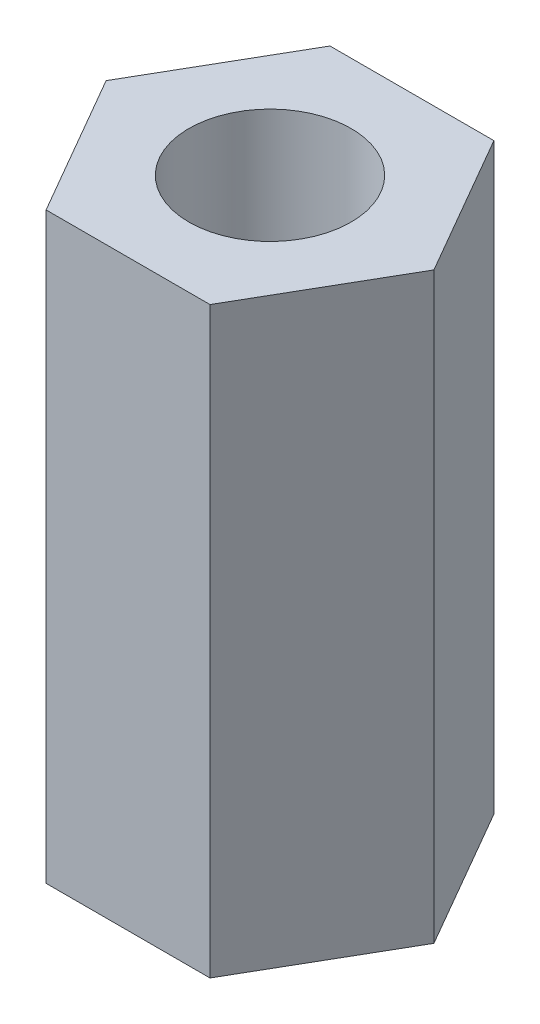
ISO-10303-21;
HEADER;
FILE_DESCRIPTION(('STEP AP214'),'2;1');
FILE_NAME('part.step','',(''),(''),'','','');
FILE_SCHEMA(('AUTOMOTIVE_DESIGN { 1 0 10303 214 1 1 1 1 }'));
ENDSEC;
DATA;
#1=APPLICATION_CONTEXT('core data for automotive mechanical design processes');
#2=APPLICATION_PROTOCOL_DEFINITION('international standard','automotive_design',2000,#1);
#3=PRODUCT_CONTEXT('',#1,'mechanical');
#4=PRODUCT('Part','Part','',(#3));
#5=PRODUCT_RELATED_PRODUCT_CATEGORY('part','',(#4));
#6=PRODUCT_DEFINITION_FORMATION('','',#4);
#7=PRODUCT_DEFINITION_CONTEXT('part definition',#1,'design');
#8=PRODUCT_DEFINITION('design','',#6,#7);
#9=PRODUCT_DEFINITION_SHAPE('','',#8);
#10=(LENGTH_UNIT() NAMED_UNIT(*) SI_UNIT(.MILLI.,.METRE.));
#11=(NAMED_UNIT(*) PLANE_ANGLE_UNIT() SI_UNIT($,.RADIAN.));
#12=(NAMED_UNIT(*) SI_UNIT($,.STERADIAN.) SOLID_ANGLE_UNIT());
#13=UNCERTAINTY_MEASURE_WITH_UNIT(LENGTH_MEASURE(1.E-05),#10,'distance_accuracy_value','');
#14=(GEOMETRIC_REPRESENTATION_CONTEXT(3) GLOBAL_UNCERTAINTY_ASSIGNED_CONTEXT((#13)) GLOBAL_UNIT_ASSIGNED_CONTEXT((#10,
#11,#12)) REPRESENTATION_CONTEXT('',''));
#15=CARTESIAN_POINT('',(0.,0.,0.));
#16=DIRECTION('',(0.,0.,1.));
#17=DIRECTION('',(1.,0.,0.));
#18=AXIS2_PLACEMENT_3D('',#15,#16,#17);
#19=CARTESIAN_POINT('',(0.,14.38,0.));
#20=DIRECTION('',(0.,1.,0.));
#21=DIRECTION('',(0.,0.,1.));
#22=AXIS2_PLACEMENT_3D('',#19,#20,#21);
#23=PLANE('',#22);
#24=DIRECTION('',(-0.5,0.,-0.866025403784438));
#25=VECTOR('',#24,1.);
#26=CARTESIAN_POINT('',(4.04145188432738,14.38,0.));
#27=LINE('',#26,#25);
#28=CARTESIAN_POINT('',(4.04145188432738,14.38,0.));
#29=VERTEX_POINT('',#28);
#30=CARTESIAN_POINT('',(2.02072594216369,14.38,-3.5));
#31=VERTEX_POINT('',#30);
#32=EDGE_CURVE('E152',#29,#31,#27,.T.);
#33=ORIENTED_EDGE('',*,*,#32,.T.);
#34=DIRECTION('',(-1.,0.,0.));
#35=VECTOR('',#34,1.);
#36=CARTESIAN_POINT('',(2.02072594216369,14.38,-3.5));
#37=LINE('',#36,#35);
#38=CARTESIAN_POINT('',(-2.02072594216369,14.38,-3.5));
#39=VERTEX_POINT('',#38);
#40=EDGE_CURVE('E100',#31,#39,#37,.T.);
#41=ORIENTED_EDGE('',*,*,#40,.T.);
#42=DIRECTION('',(-0.5,0.,0.866025403784439));
#43=VECTOR('',#42,1.);
#44=CARTESIAN_POINT('',(-2.02072594216369,14.38,-3.5));
#45=LINE('',#44,#43);
#46=CARTESIAN_POINT('',(-4.04145188432738,14.38,0.));
#47=VERTEX_POINT('',#46);
#48=EDGE_CURVE('E113',#39,#47,#45,.T.);
#49=ORIENTED_EDGE('',*,*,#48,.T.);
#50=DIRECTION('',(0.500000000000001,0.,0.866025403784438));
#51=VECTOR('',#50,1.);
#52=CARTESIAN_POINT('',(-4.04145188432738,14.38,0.));
#53=LINE('',#52,#51);
#54=CARTESIAN_POINT('',(-2.02072594216368,14.38,3.5));
#55=VERTEX_POINT('',#54);
#56=EDGE_CURVE('E107',#47,#55,#53,.T.);
#57=ORIENTED_EDGE('',*,*,#56,.T.);
#58=DIRECTION('',(1.,0.,0.));
#59=VECTOR('',#58,1.);
#60=CARTESIAN_POINT('',(-2.02072594216368,14.38,3.5));
#61=LINE('',#60,#59);
#62=CARTESIAN_POINT('',(2.02072594216369,14.38,3.5));
#63=VERTEX_POINT('',#62);
#64=EDGE_CURVE('E111',#55,#63,#61,.T.);
#65=ORIENTED_EDGE('',*,*,#64,.T.);
#66=DIRECTION('',(0.5,0.,-0.866025403784439));
#67=VECTOR('',#66,1.);
#68=CARTESIAN_POINT('',(2.02072594216369,14.38,3.5));
#69=LINE('',#68,#67);
#70=EDGE_CURVE('E63',#63,#29,#69,.T.);
#71=ORIENTED_EDGE('',*,*,#70,.T.);
#72=EDGE_LOOP('',(#33,#41,#49,#57,#65,#71));
#73=FACE_BOUND('',#72,.T.);
#74=CARTESIAN_POINT('',(0.,14.38,0.));
#75=DIRECTION('',(0.,1.,0.));
#76=DIRECTION('',(0.,0.,1.));
#77=AXIS2_PLACEMENT_3D('',#74,#75,#76);
#78=CIRCLE('',#77,2.);
#79=CARTESIAN_POINT('',(0.,14.38,2.));
#80=VERTEX_POINT('',#79);
#81=EDGE_CURVE('E140',#80,#80,#78,.T.);
#82=ORIENTED_EDGE('',*,*,#81,.F.);
#83=EDGE_LOOP('',(#82));
#84=FACE_BOUND('',#83,.T.);
#85=ADVANCED_FACE('F45',(#73,#84),#23,.T.);
#86=CARTESIAN_POINT('',(0.,0.,0.));
#87=DIRECTION('',(0.,1.,0.));
#88=DIRECTION('',(0.,0.,1.));
#89=AXIS2_PLACEMENT_3D('',#86,#87,#88);
#90=PLANE('',#89);
#91=DIRECTION('',(-0.5,0.,-0.866025403784438));
#92=VECTOR('',#91,1.);
#93=CARTESIAN_POINT('',(4.04145188432738,0.,0.));
#94=LINE('',#93,#92);
#95=CARTESIAN_POINT('',(4.04145188432738,0.,0.));
#96=VERTEX_POINT('',#95);
#97=CARTESIAN_POINT('',(2.02072594216369,0.,-3.5));
#98=VERTEX_POINT('',#97);
#99=EDGE_CURVE('E135',#96,#98,#94,.T.);
#100=ORIENTED_EDGE('',*,*,#99,.F.);
#101=DIRECTION('',(0.5,0.,-0.866025403784439));
#102=VECTOR('',#101,1.);
#103=CARTESIAN_POINT('',(2.02072594216369,0.,3.5));
#104=LINE('',#103,#102);
#105=CARTESIAN_POINT('',(2.02072594216369,0.,3.5));
#106=VERTEX_POINT('',#105);
#107=EDGE_CURVE('E92',#106,#96,#104,.T.);
#108=ORIENTED_EDGE('',*,*,#107,.F.);
#109=DIRECTION('',(1.,0.,0.));
#110=VECTOR('',#109,1.);
#111=CARTESIAN_POINT('',(-2.02072594216368,0.,3.5));
#112=LINE('',#111,#110);
#113=CARTESIAN_POINT('',(-2.02072594216368,0.,3.5));
#114=VERTEX_POINT('',#113);
#115=EDGE_CURVE('E86',#114,#106,#112,.T.);
#116=ORIENTED_EDGE('',*,*,#115,.F.);
#117=DIRECTION('',(0.500000000000001,0.,0.866025403784438));
#118=VECTOR('',#117,1.);
#119=CARTESIAN_POINT('',(-4.04145188432738,0.,0.));
#120=LINE('',#119,#118);
#121=CARTESIAN_POINT('',(-4.04145188432738,0.,0.));
#122=VERTEX_POINT('',#121);
#123=EDGE_CURVE('E122',#122,#114,#120,.T.);
#124=ORIENTED_EDGE('',*,*,#123,.F.);
#125=DIRECTION('',(-0.5,0.,0.866025403784439));
#126=VECTOR('',#125,1.);
#127=CARTESIAN_POINT('',(-2.02072594216369,0.,-3.5));
#128=LINE('',#127,#126);
#129=CARTESIAN_POINT('',(-2.02072594216369,0.,-3.5));
#130=VERTEX_POINT('',#129);
#131=EDGE_CURVE('E143',#130,#122,#128,.T.);
#132=ORIENTED_EDGE('',*,*,#131,.F.);
#133=DIRECTION('',(-1.,0.,0.));
#134=VECTOR('',#133,1.);
#135=CARTESIAN_POINT('',(2.02072594216369,0.,-3.5));
#136=LINE('',#135,#134);
#137=EDGE_CURVE('E139',#98,#130,#136,.T.);
#138=ORIENTED_EDGE('',*,*,#137,.F.);
#139=EDGE_LOOP('',(#100,#108,#116,#124,#132,#138));
#140=FACE_BOUND('',#139,.T.);
#141=CARTESIAN_POINT('',(0.,0.,0.));
#142=DIRECTION('',(0.,1.,0.));
#143=DIRECTION('',(0.,0.,1.));
#144=AXIS2_PLACEMENT_3D('',#141,#142,#143);
#145=CIRCLE('',#144,2.);
#146=CARTESIAN_POINT('',(0.,0.,2.));
#147=VERTEX_POINT('',#146);
#148=EDGE_CURVE('E249',#147,#147,#145,.T.);
#149=ORIENTED_EDGE('',*,*,#148,.T.);
#150=EDGE_LOOP('',(#149));
#151=FACE_BOUND('',#150,.T.);
#152=ADVANCED_FACE('F165',(#140,#151),#90,.F.);
#153=CARTESIAN_POINT('',(4.04145188432738,14.38,0.));
#154=DIRECTION('',(-0.866025403784439,0.,0.5));
#155=DIRECTION('',(0.5,0.,0.866025403784439));
#156=AXIS2_PLACEMENT_3D('',#153,#154,#155);
#157=PLANE('',#156);
#158=ORIENTED_EDGE('',*,*,#99,.T.);
#159=DIRECTION('',(0.,-1.,0.));
#160=VECTOR('',#159,1.);
#161=CARTESIAN_POINT('',(2.02072594216369,14.38,-3.5));
#162=LINE('',#161,#160);
#163=EDGE_CURVE('E11',#31,#98,#162,.T.);
#164=ORIENTED_EDGE('',*,*,#163,.F.);
#165=ORIENTED_EDGE('',*,*,#32,.F.);
#166=DIRECTION('',(0.,-1.,0.));
#167=VECTOR('',#166,1.);
#168=CARTESIAN_POINT('',(4.04145188432738,14.38,0.));
#169=LINE('',#168,#167);
#170=EDGE_CURVE('E131',#29,#96,#169,.T.);
#171=ORIENTED_EDGE('',*,*,#170,.T.);
#172=EDGE_LOOP('',(#158,#164,#165,#171));
#173=FACE_BOUND('',#172,.T.);
#174=ADVANCED_FACE('F47',(#173),#157,.F.);
#175=CARTESIAN_POINT('',(2.02072594216369,14.38,-3.5));
#176=DIRECTION('',(0.,0.,1.));
#177=DIRECTION('',(1.,0.,0.));
#178=AXIS2_PLACEMENT_3D('',#175,#176,#177);
#179=PLANE('',#178);
#180=ORIENTED_EDGE('',*,*,#137,.T.);
#181=DIRECTION('',(0.,-1.,0.));
#182=VECTOR('',#181,1.);
#183=CARTESIAN_POINT('',(-2.02072594216369,14.38,-3.5));
#184=LINE('',#183,#182);
#185=EDGE_CURVE('E55',#39,#130,#184,.T.);
#186=ORIENTED_EDGE('',*,*,#185,.F.);
#187=ORIENTED_EDGE('',*,*,#40,.F.);
#188=ORIENTED_EDGE('',*,*,#163,.T.);
#189=EDGE_LOOP('',(#180,#186,#187,#188));
#190=FACE_BOUND('',#189,.T.);
#191=ADVANCED_FACE('F190',(#190),#179,.F.);
#192=CARTESIAN_POINT('',(-2.02072594216369,14.38,-3.5));
#193=DIRECTION('',(0.866025403784439,0.,0.5));
#194=DIRECTION('',(0.5,0.,-0.866025403784439));
#195=AXIS2_PLACEMENT_3D('',#192,#193,#194);
#196=PLANE('',#195);
#197=ORIENTED_EDGE('',*,*,#131,.T.);
#198=DIRECTION('',(0.,-1.,0.));
#199=VECTOR('',#198,1.);
#200=CARTESIAN_POINT('',(-4.04145188432738,14.38,0.));
#201=LINE('',#200,#199);
#202=EDGE_CURVE('E124',#47,#122,#201,.T.);
#203=ORIENTED_EDGE('',*,*,#202,.F.);
#204=ORIENTED_EDGE('',*,*,#48,.F.);
#205=ORIENTED_EDGE('',*,*,#185,.T.);
#206=EDGE_LOOP('',(#197,#203,#204,#205));
#207=FACE_BOUND('',#206,.T.);
#208=ADVANCED_FACE('F162',(#207),#196,.F.);
#209=CARTESIAN_POINT('',(-4.04145188432738,14.38,0.));
#210=DIRECTION('',(0.866025403784438,0.,-0.5));
#211=DIRECTION('',(-0.5,0.,-0.866025403784438));
#212=AXIS2_PLACEMENT_3D('',#209,#210,#211);
#213=PLANE('',#212);
#214=ORIENTED_EDGE('',*,*,#123,.T.);
#215=DIRECTION('',(0.,-1.,0.));
#216=VECTOR('',#215,1.);
#217=CARTESIAN_POINT('',(-2.02072594216368,14.38,3.5));
#218=LINE('',#217,#216);
#219=EDGE_CURVE('E119',#55,#114,#218,.T.);
#220=ORIENTED_EDGE('',*,*,#219,.F.);
#221=ORIENTED_EDGE('',*,*,#56,.F.);
#222=ORIENTED_EDGE('',*,*,#202,.T.);
#223=EDGE_LOOP('',(#214,#220,#221,#222));
#224=FACE_BOUND('',#223,.T.);
#225=ADVANCED_FACE('F120',(#224),#213,.F.);
#226=CARTESIAN_POINT('',(-2.02072594216368,14.38,3.5));
#227=DIRECTION('',(0.,0.,-1.));
#228=DIRECTION('',(-1.,0.,0.));
#229=AXIS2_PLACEMENT_3D('',#226,#227,#228);
#230=PLANE('',#229);
#231=ORIENTED_EDGE('',*,*,#115,.T.);
#232=DIRECTION('',(0.,-1.,0.));
#233=VECTOR('',#232,1.);
#234=CARTESIAN_POINT('',(2.02072594216369,14.38,3.5));
#235=LINE('',#234,#233);
#236=EDGE_CURVE('E125',#63,#106,#235,.T.);
#237=ORIENTED_EDGE('',*,*,#236,.F.);
#238=ORIENTED_EDGE('',*,*,#64,.F.);
#239=ORIENTED_EDGE('',*,*,#219,.T.);
#240=EDGE_LOOP('',(#231,#237,#238,#239));
#241=FACE_BOUND('',#240,.T.);
#242=ADVANCED_FACE('F127',(#241),#230,.F.);
#243=CARTESIAN_POINT('',(2.02072594216369,14.38,3.5));
#244=DIRECTION('',(-0.866025403784439,0.,-0.5));
#245=DIRECTION('',(-0.5,0.,0.866025403784439));
#246=AXIS2_PLACEMENT_3D('',#243,#244,#245);
#247=PLANE('',#246);
#248=ORIENTED_EDGE('',*,*,#107,.T.);
#249=ORIENTED_EDGE('',*,*,#170,.F.);
#250=ORIENTED_EDGE('',*,*,#70,.F.);
#251=ORIENTED_EDGE('',*,*,#236,.T.);
#252=EDGE_LOOP('',(#248,#249,#250,#251));
#253=FACE_BOUND('',#252,.T.);
#254=ADVANCED_FACE('F170',(#253),#247,.F.);
#255=CARTESIAN_POINT('',(0.,14.38,0.));
#256=DIRECTION('',(0.,-1.,0.));
#257=DIRECTION('',(0.,0.,-1.));
#258=AXIS2_PLACEMENT_3D('',#255,#256,#257);
#259=CYLINDRICAL_SURFACE('',#258,2.);
#260=ORIENTED_EDGE('',*,*,#81,.T.);
#261=EDGE_LOOP('',(#260));
#262=FACE_BOUND('',#261,.T.);
#263=ORIENTED_EDGE('',*,*,#148,.F.);
#264=EDGE_LOOP('',(#263));
#265=FACE_BOUND('',#264,.T.);
#266=ADVANCED_FACE('F172',(#262,#265),#259,.F.);
#267=CLOSED_SHELL('',(#85,#152,#174,#191,#208,#225,#242,#254,#266));
#268=MANIFOLD_SOLID_BREP('B2',#267);
#269=ADVANCED_BREP_SHAPE_REPRESENTATION('',(#18,#268),#14);
#270=SHAPE_DEFINITION_REPRESENTATION(#9,#269);
ENDSEC;
END-ISO-10303-21;
